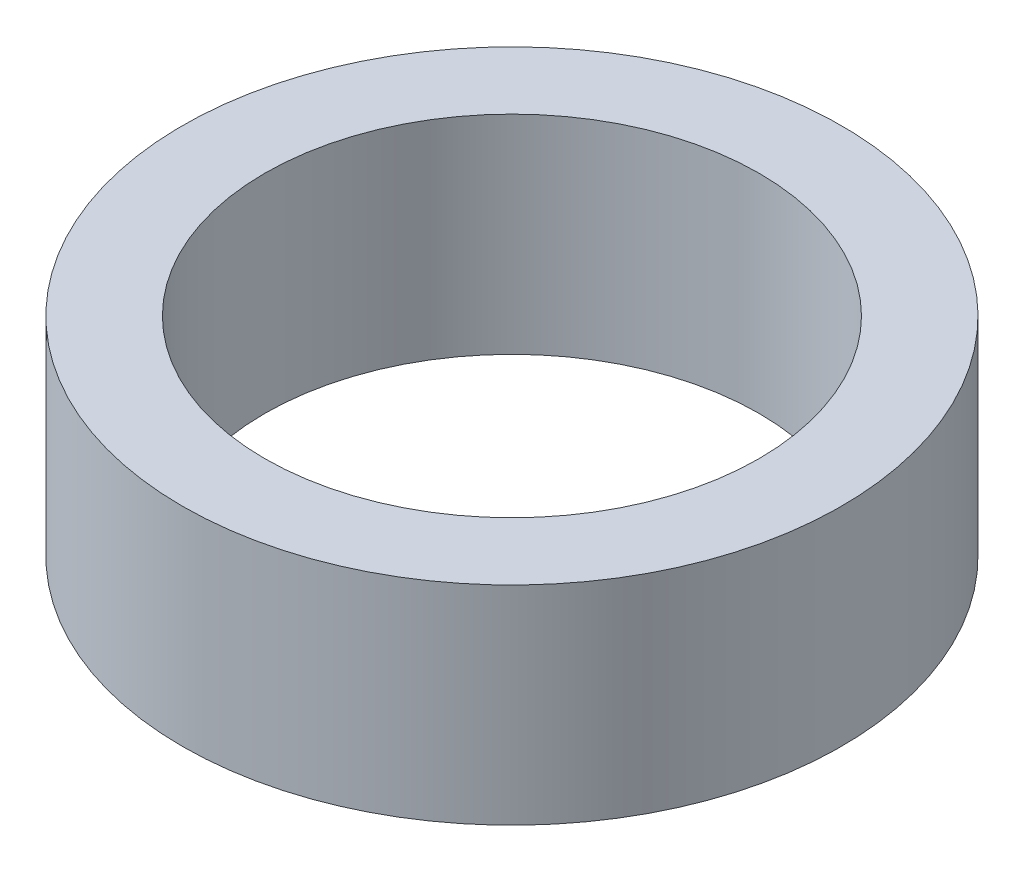
ISO-10303-21;
HEADER;
FILE_DESCRIPTION(('STEP AP214'),'2;1');
FILE_NAME('part.step','',(''),(''),'','','');
FILE_SCHEMA(('AUTOMOTIVE_DESIGN { 1 0 10303 214 1 1 1 1 }'));
ENDSEC;
DATA;
#1=APPLICATION_CONTEXT('core data for automotive mechanical design processes');
#2=APPLICATION_PROTOCOL_DEFINITION('international standard','automotive_design',2000,#1);
#3=PRODUCT_CONTEXT('',#1,'mechanical');
#4=PRODUCT('Part','Part','',(#3));
#5=PRODUCT_RELATED_PRODUCT_CATEGORY('part','',(#4));
#6=PRODUCT_DEFINITION_FORMATION('','',#4);
#7=PRODUCT_DEFINITION_CONTEXT('part definition',#1,'design');
#8=PRODUCT_DEFINITION('design','',#6,#7);
#9=PRODUCT_DEFINITION_SHAPE('','',#8);
#10=(LENGTH_UNIT() NAMED_UNIT(*) SI_UNIT(.MILLI.,.METRE.));
#11=(NAMED_UNIT(*) PLANE_ANGLE_UNIT() SI_UNIT($,.RADIAN.));
#12=(NAMED_UNIT(*) SI_UNIT($,.STERADIAN.) SOLID_ANGLE_UNIT());
#13=UNCERTAINTY_MEASURE_WITH_UNIT(LENGTH_MEASURE(1.E-05),#10,'distance_accuracy_value','');
#14=(GEOMETRIC_REPRESENTATION_CONTEXT(3) GLOBAL_UNCERTAINTY_ASSIGNED_CONTEXT((#13)) GLOBAL_UNIT_ASSIGNED_CONTEXT((#10,
#11,#12)) REPRESENTATION_CONTEXT('',''));
#15=CARTESIAN_POINT('',(0.,0.,0.));
#16=DIRECTION('',(0.,0.,1.));
#17=DIRECTION('',(1.,0.,0.));
#18=AXIS2_PLACEMENT_3D('',#15,#16,#17);
#19=CARTESIAN_POINT('',(0.,6.4135,0.));
#20=DIRECTION('',(0.,1.,0.));
#21=DIRECTION('',(0.,0.,1.));
#22=AXIS2_PLACEMENT_3D('',#19,#20,#21);
#23=PLANE('',#22);
#24=CARTESIAN_POINT('',(0.,6.4135,0.));
#25=DIRECTION('',(0.,1.,0.));
#26=DIRECTION('',(0.,0.,1.));
#27=AXIS2_PLACEMENT_3D('',#24,#25,#26);
#28=CIRCLE('',#27,10.16);
#29=CARTESIAN_POINT('',(0.,6.4135,10.16));
#30=VERTEX_POINT('',#29);
#31=EDGE_CURVE('E10',#30,#30,#28,.T.);
#32=ORIENTED_EDGE('',*,*,#31,.T.);
#33=EDGE_LOOP('',(#32));
#34=FACE_BOUND('',#33,.T.);
#35=CARTESIAN_POINT('',(0.,6.4135,0.));
#36=DIRECTION('',(0.,1.,0.));
#37=DIRECTION('',(0.,0.,1.));
#38=AXIS2_PLACEMENT_3D('',#35,#36,#37);
#39=CIRCLE('',#38,7.62);
#40=CARTESIAN_POINT('',(0.,6.4135,7.62));
#41=VERTEX_POINT('',#40);
#42=EDGE_CURVE('E42',#41,#41,#39,.T.);
#43=ORIENTED_EDGE('',*,*,#42,.F.);
#44=EDGE_LOOP('',(#43));
#45=FACE_BOUND('',#44,.T.);
#46=ADVANCED_FACE('F31',(#34,#45),#23,.T.);
#47=CARTESIAN_POINT('',(0.,0.,0.));
#48=DIRECTION('',(0.,1.,0.));
#49=DIRECTION('',(0.,0.,1.));
#50=AXIS2_PLACEMENT_3D('',#47,#48,#49);
#51=PLANE('',#50);
#52=CARTESIAN_POINT('',(0.,0.,0.));
#53=DIRECTION('',(0.,1.,0.));
#54=DIRECTION('',(0.,0.,1.));
#55=AXIS2_PLACEMENT_3D('',#52,#53,#54);
#56=CIRCLE('',#55,10.16);
#57=CARTESIAN_POINT('',(0.,0.,10.16));
#58=VERTEX_POINT('',#57);
#59=EDGE_CURVE('E35',#58,#58,#56,.T.);
#60=ORIENTED_EDGE('',*,*,#59,.F.);
#61=EDGE_LOOP('',(#60));
#62=FACE_BOUND('',#61,.T.);
#63=CARTESIAN_POINT('',(0.,0.,0.));
#64=DIRECTION('',(0.,1.,0.));
#65=DIRECTION('',(0.,0.,1.));
#66=AXIS2_PLACEMENT_3D('',#63,#64,#65);
#67=CIRCLE('',#66,7.62);
#68=CARTESIAN_POINT('',(0.,0.,7.62));
#69=VERTEX_POINT('',#68);
#70=EDGE_CURVE('E44',#69,#69,#67,.T.);
#71=ORIENTED_EDGE('',*,*,#70,.T.);
#72=EDGE_LOOP('',(#71));
#73=FACE_BOUND('',#72,.T.);
#74=ADVANCED_FACE('F54',(#62,#73),#51,.F.);
#75=CARTESIAN_POINT('',(0.,6.4135,0.));
#76=DIRECTION('',(0.,-1.,0.));
#77=DIRECTION('',(0.,0.,-1.));
#78=AXIS2_PLACEMENT_3D('',#75,#76,#77);
#79=CYLINDRICAL_SURFACE('',#78,10.16);
#80=ORIENTED_EDGE('',*,*,#31,.F.);
#81=EDGE_LOOP('',(#80));
#82=FACE_BOUND('',#81,.T.);
#83=ORIENTED_EDGE('',*,*,#59,.T.);
#84=EDGE_LOOP('',(#83));
#85=FACE_BOUND('',#84,.T.);
#86=ADVANCED_FACE('F33',(#82,#85),#79,.T.);
#87=CARTESIAN_POINT('',(0.,6.4135,0.));
#88=DIRECTION('',(0.,-1.,0.));
#89=DIRECTION('',(0.,0.,-1.));
#90=AXIS2_PLACEMENT_3D('',#87,#88,#89);
#91=CYLINDRICAL_SURFACE('',#90,7.62);
#92=ORIENTED_EDGE('',*,*,#42,.T.);
#93=EDGE_LOOP('',(#92));
#94=FACE_BOUND('',#93,.T.);
#95=ORIENTED_EDGE('',*,*,#70,.F.);
#96=EDGE_LOOP('',(#95));
#97=FACE_BOUND('',#96,.T.);
#98=ADVANCED_FACE('F50',(#94,#97),#91,.F.);
#99=CLOSED_SHELL('',(#46,#74,#86,#98));
#100=MANIFOLD_SOLID_BREP('B2',#99);
#101=ADVANCED_BREP_SHAPE_REPRESENTATION('',(#18,#100),#14);
#102=SHAPE_DEFINITION_REPRESENTATION(#9,#101);
ENDSEC;
END-ISO-10303-21;
